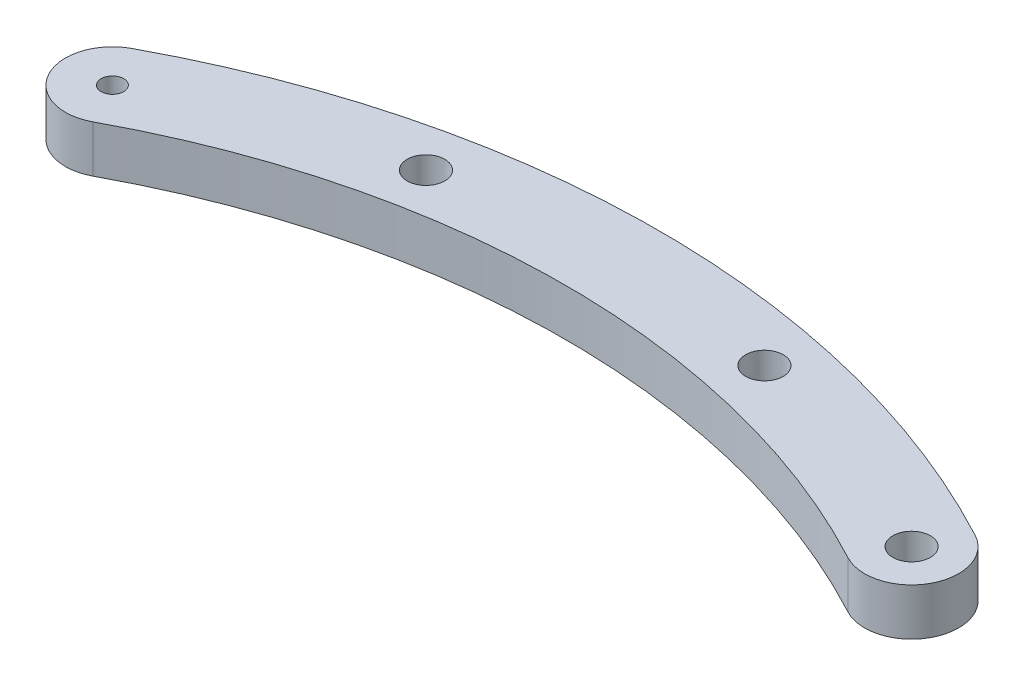
ISO-10303-21;
HEADER;
FILE_DESCRIPTION(('STEP AP214'),'2;1');
FILE_NAME('part.step','',(''),(''),'','','');
FILE_SCHEMA(('AUTOMOTIVE_DESIGN { 1 0 10303 214 1 1 1 1 }'));
ENDSEC;
DATA;
#1=APPLICATION_CONTEXT('core data for automotive mechanical design processes');
#2=APPLICATION_PROTOCOL_DEFINITION('international standard','automotive_design',2000,#1);
#3=PRODUCT_CONTEXT('',#1,'mechanical');
#4=PRODUCT('Part','Part','',(#3));
#5=PRODUCT_RELATED_PRODUCT_CATEGORY('part','',(#4));
#6=PRODUCT_DEFINITION_FORMATION('','',#4);
#7=PRODUCT_DEFINITION_CONTEXT('part definition',#1,'design');
#8=PRODUCT_DEFINITION('design','',#6,#7);
#9=PRODUCT_DEFINITION_SHAPE('','',#8);
#10=(LENGTH_UNIT() NAMED_UNIT(*) SI_UNIT(.MILLI.,.METRE.));
#11=(NAMED_UNIT(*) PLANE_ANGLE_UNIT() SI_UNIT($,.RADIAN.));
#12=(NAMED_UNIT(*) SI_UNIT($,.STERADIAN.) SOLID_ANGLE_UNIT());
#13=UNCERTAINTY_MEASURE_WITH_UNIT(LENGTH_MEASURE(1.E-05),#10,'distance_accuracy_value','');
#14=(GEOMETRIC_REPRESENTATION_CONTEXT(3) GLOBAL_UNCERTAINTY_ASSIGNED_CONTEXT((#13)) GLOBAL_UNIT_ASSIGNED_CONTEXT((#10,
#11,#12)) REPRESENTATION_CONTEXT('',''));
#15=CARTESIAN_POINT('',(0.,0.,0.));
#16=DIRECTION('',(0.,0.,1.));
#17=DIRECTION('',(1.,0.,0.));
#18=AXIS2_PLACEMENT_3D('',#15,#16,#17);
#19=CARTESIAN_POINT('',(0.,2.5,0.));
#20=DIRECTION('',(0.,-1.,0.));
#21=DIRECTION('',(0.,0.,-1.));
#22=AXIS2_PLACEMENT_3D('',#19,#20,#21);
#23=CYLINDRICAL_SURFACE('',#22,2.50000000000001);
#24=CARTESIAN_POINT('',(0.,0.,0.));
#25=DIRECTION('',(0.,1.,0.));
#26=DIRECTION('',(0.,0.,1.));
#27=AXIS2_PLACEMENT_3D('',#24,#25,#26);
#28=CIRCLE('',#27,2.50000000000001);
#29=CARTESIAN_POINT('',(-1.18055555555556,0.,-2.20369884064201));
#30=VERTEX_POINT('',#29);
#31=CARTESIAN_POINT('',(1.18055555555556,0.,2.20369884064201));
#32=VERTEX_POINT('',#31);
#33=EDGE_CURVE('E112',#30,#32,#28,.T.);
#34=ORIENTED_EDGE('',*,*,#33,.T.);
#35=DIRECTION('',(0.,-1.,0.));
#36=VECTOR('',#35,1.);
#37=CARTESIAN_POINT('',(1.18055555555556,2.5,2.20369884064201));
#38=LINE('',#37,#36);
#39=CARTESIAN_POINT('',(1.18055555555556,2.5,2.20369884064201));
#40=VERTEX_POINT('',#39);
#41=EDGE_CURVE('E11',#40,#32,#38,.T.);
#42=ORIENTED_EDGE('',*,*,#41,.F.);
#43=CARTESIAN_POINT('',(0.,2.5,0.));
#44=DIRECTION('',(0.,1.,0.));
#45=DIRECTION('',(0.,0.,1.));
#46=AXIS2_PLACEMENT_3D('',#43,#44,#45);
#47=CIRCLE('',#46,2.50000000000001);
#48=CARTESIAN_POINT('',(-1.18055555555556,2.5,-2.20369884064201));
#49=VERTEX_POINT('',#48);
#50=EDGE_CURVE('E92',#49,#40,#47,.T.);
#51=ORIENTED_EDGE('',*,*,#50,.F.);
#52=DIRECTION('',(0.,-1.,0.));
#53=VECTOR('',#52,1.);
#54=CARTESIAN_POINT('',(-1.18055555555556,2.5,-2.20369884064201));
#55=LINE('',#54,#53);
#56=EDGE_CURVE('E58',#49,#30,#55,.T.);
#57=ORIENTED_EDGE('',*,*,#56,.T.);
#58=EDGE_LOOP('',(#34,#42,#51,#57));
#59=FACE_BOUND('',#58,.T.);
#60=ADVANCED_FACE('F41',(#59),#23,.T.);
#61=CARTESIAN_POINT('',(21.25,2.5,39.6665791315561));
#62=DIRECTION('',(0.,-1.,0.));
#63=DIRECTION('',(0.,0.,-1.));
#64=AXIS2_PLACEMENT_3D('',#61,#62,#63);
#65=CYLINDRICAL_SURFACE('',#64,42.5);
#66=CARTESIAN_POINT('',(21.25,0.,39.6665791315561));
#67=DIRECTION('',(0.,1.,0.));
#68=DIRECTION('',(0.,0.,1.));
#69=AXIS2_PLACEMENT_3D('',#66,#67,#68);
#70=CIRCLE('',#69,42.5);
#71=CARTESIAN_POINT('',(41.3194444444444,0.,2.20369884064201));
#72=VERTEX_POINT('',#71);
#73=EDGE_CURVE('E97',#32,#72,#70,.F.);
#74=ORIENTED_EDGE('',*,*,#73,.T.);
#75=DIRECTION('',(0.,-1.,0.));
#76=VECTOR('',#75,1.);
#77=CARTESIAN_POINT('',(41.3194444444444,2.5,2.20369884064201));
#78=LINE('',#77,#76);
#79=CARTESIAN_POINT('',(41.3194444444444,2.5,2.20369884064201));
#80=VERTEX_POINT('',#79);
#81=EDGE_CURVE('E50',#80,#72,#78,.T.);
#82=ORIENTED_EDGE('',*,*,#81,.F.);
#83=CARTESIAN_POINT('',(21.25,2.5,39.6665791315561));
#84=DIRECTION('',(0.,1.,0.));
#85=DIRECTION('',(0.,0.,1.));
#86=AXIS2_PLACEMENT_3D('',#83,#84,#85);
#87=CIRCLE('',#86,42.5);
#88=EDGE_CURVE('E84',#40,#80,#87,.F.);
#89=ORIENTED_EDGE('',*,*,#88,.F.);
#90=ORIENTED_EDGE('',*,*,#41,.T.);
#91=EDGE_LOOP('',(#74,#82,#89,#90));
#92=FACE_BOUND('',#91,.T.);
#93=ADVANCED_FACE('F96',(#92),#65,.F.);
#94=CARTESIAN_POINT('',(42.5,2.5,0.));
#95=DIRECTION('',(0.,-1.,0.));
#96=DIRECTION('',(0.,0.,-1.));
#97=AXIS2_PLACEMENT_3D('',#94,#95,#96);
#98=CYLINDRICAL_SURFACE('',#97,2.50000000000001);
#99=CARTESIAN_POINT('',(42.5,0.,0.));
#100=DIRECTION('',(0.,1.,0.));
#101=DIRECTION('',(0.,0.,1.));
#102=AXIS2_PLACEMENT_3D('',#99,#100,#101);
#103=CIRCLE('',#102,2.50000000000001);
#104=CARTESIAN_POINT('',(43.6805555555556,0.,-2.20369884064201));
#105=VERTEX_POINT('',#104);
#106=EDGE_CURVE('E116',#72,#105,#103,.T.);
#107=ORIENTED_EDGE('',*,*,#106,.T.);
#108=DIRECTION('',(0.,-1.,0.));
#109=VECTOR('',#108,1.);
#110=CARTESIAN_POINT('',(43.6805555555556,2.5,-2.20369884064201));
#111=LINE('',#110,#109);
#112=CARTESIAN_POINT('',(43.6805555555556,2.5,-2.20369884064201));
#113=VERTEX_POINT('',#112);
#114=EDGE_CURVE('E73',#113,#105,#111,.T.);
#115=ORIENTED_EDGE('',*,*,#114,.F.);
#116=CARTESIAN_POINT('',(42.5,2.5,0.));
#117=DIRECTION('',(0.,1.,0.));
#118=DIRECTION('',(0.,0.,1.));
#119=AXIS2_PLACEMENT_3D('',#116,#117,#118);
#120=CIRCLE('',#119,2.50000000000001);
#121=EDGE_CURVE('E91',#80,#113,#120,.T.);
#122=ORIENTED_EDGE('',*,*,#121,.F.);
#123=ORIENTED_EDGE('',*,*,#81,.T.);
#124=EDGE_LOOP('',(#107,#115,#122,#123));
#125=FACE_BOUND('',#124,.T.);
#126=ADVANCED_FACE('F100',(#125),#98,.T.);
#127=CARTESIAN_POINT('',(21.25,2.5,39.6665791315561));
#128=DIRECTION('',(0.,-1.,0.));
#129=DIRECTION('',(0.,0.,-1.));
#130=AXIS2_PLACEMENT_3D('',#127,#128,#129);
#131=CYLINDRICAL_SURFACE('',#130,47.5);
#132=CARTESIAN_POINT('',(21.25,0.,39.6665791315561));
#133=DIRECTION('',(0.,1.,0.));
#134=DIRECTION('',(0.,0.,1.));
#135=AXIS2_PLACEMENT_3D('',#132,#133,#134);
#136=CIRCLE('',#135,47.5);
#137=EDGE_CURVE('E118',#30,#105,#136,.F.);
#138=ORIENTED_EDGE('',*,*,#137,.F.);
#139=ORIENTED_EDGE('',*,*,#56,.F.);
#140=CARTESIAN_POINT('',(21.25,2.5,39.6665791315561));
#141=DIRECTION('',(0.,1.,0.));
#142=DIRECTION('',(0.,0.,1.));
#143=AXIS2_PLACEMENT_3D('',#140,#141,#142);
#144=CIRCLE('',#143,47.5);
#145=EDGE_CURVE('E101',#49,#113,#144,.F.);
#146=ORIENTED_EDGE('',*,*,#145,.T.);
#147=ORIENTED_EDGE('',*,*,#114,.T.);
#148=EDGE_LOOP('',(#138,#139,#146,#147));
#149=FACE_BOUND('',#148,.T.);
#150=ADVANCED_FACE('F178',(#149),#131,.T.);
#151=CARTESIAN_POINT('',(0.,2.5,0.));
#152=DIRECTION('',(0.,-1.,0.));
#153=DIRECTION('',(0.,0.,-1.));
#154=AXIS2_PLACEMENT_3D('',#151,#152,#153);
#155=CYLINDRICAL_SURFACE('',#154,0.6);
#156=CARTESIAN_POINT('',(0.,2.5,0.));
#157=DIRECTION('',(0.,1.,0.));
#158=DIRECTION('',(0.,0.,1.));
#159=AXIS2_PLACEMENT_3D('',#156,#157,#158);
#160=CIRCLE('',#159,0.6);
#161=CARTESIAN_POINT('',(0.,2.5,0.6));
#162=VERTEX_POINT('',#161);
#163=EDGE_CURVE('E124',#162,#162,#160,.T.);
#164=ORIENTED_EDGE('',*,*,#163,.T.);
#165=EDGE_LOOP('',(#164));
#166=FACE_BOUND('',#165,.T.);
#167=CARTESIAN_POINT('',(0.,0.,0.));
#168=DIRECTION('',(0.,1.,0.));
#169=DIRECTION('',(0.,0.,1.));
#170=AXIS2_PLACEMENT_3D('',#167,#168,#169);
#171=CIRCLE('',#170,0.6);
#172=CARTESIAN_POINT('',(0.,0.,0.6));
#173=VERTEX_POINT('',#172);
#174=EDGE_CURVE('E109',#173,#173,#171,.T.);
#175=ORIENTED_EDGE('',*,*,#174,.F.);
#176=EDGE_LOOP('',(#175));
#177=FACE_BOUND('',#176,.T.);
#178=ADVANCED_FACE('F43',(#166,#177),#155,.F.);
#179=CARTESIAN_POINT('',(42.5,2.5,0.));
#180=DIRECTION('',(0.,-1.,0.));
#181=DIRECTION('',(0.,0.,-1.));
#182=AXIS2_PLACEMENT_3D('',#179,#180,#181);
#183=CYLINDRICAL_SURFACE('',#182,0.999999999999998);
#184=CARTESIAN_POINT('',(42.5,2.5,0.));
#185=DIRECTION('',(0.,1.,0.));
#186=DIRECTION('',(0.,0.,1.));
#187=AXIS2_PLACEMENT_3D('',#184,#185,#186);
#188=CIRCLE('',#187,0.999999999999998);
#189=CARTESIAN_POINT('',(42.5,2.5,0.999999999999998));
#190=VERTEX_POINT('',#189);
#191=EDGE_CURVE('E103',#190,#190,#188,.T.);
#192=ORIENTED_EDGE('',*,*,#191,.T.);
#193=EDGE_LOOP('',(#192));
#194=FACE_BOUND('',#193,.T.);
#195=CARTESIAN_POINT('',(42.5,0.,0.));
#196=DIRECTION('',(0.,1.,0.));
#197=DIRECTION('',(0.,0.,1.));
#198=AXIS2_PLACEMENT_3D('',#195,#196,#197);
#199=CIRCLE('',#198,0.999999999999998);
#200=CARTESIAN_POINT('',(42.5,0.,0.999999999999998));
#201=VERTEX_POINT('',#200);
#202=EDGE_CURVE('E121',#201,#201,#199,.T.);
#203=ORIENTED_EDGE('',*,*,#202,.F.);
#204=EDGE_LOOP('',(#203));
#205=FACE_BOUND('',#204,.T.);
#206=ADVANCED_FACE('F157',(#194,#205),#183,.F.);
#207=CARTESIAN_POINT('',(0.,2.5,0.));
#208=DIRECTION('',(0.,1.,0.));
#209=DIRECTION('',(0.,0.,1.));
#210=AXIS2_PLACEMENT_3D('',#207,#208,#209);
#211=PLANE('',#210);
#212=CARTESIAN_POINT('',(12.25,2.5,-4.42423623854113));
#213=DIRECTION('',(0.,1.,0.));
#214=DIRECTION('',(0.,0.,1.));
#215=AXIS2_PLACEMENT_3D('',#212,#213,#214);
#216=CIRCLE('',#215,1.);
#217=CARTESIAN_POINT('',(12.25,2.5,-3.42423623854112));
#218=VERTEX_POINT('',#217);
#219=EDGE_CURVE('E139',#218,#218,#216,.T.);
#220=ORIENTED_EDGE('',*,*,#219,.F.);
#221=EDGE_LOOP('',(#220));
#222=FACE_BOUND('',#221,.T.);
#223=CARTESIAN_POINT('',(30.25,2.5,-4.42423623854113));
#224=DIRECTION('',(0.,1.,0.));
#225=DIRECTION('',(0.,0.,1.));
#226=AXIS2_PLACEMENT_3D('',#223,#224,#225);
#227=CIRCLE('',#226,0.999999999999998);
#228=CARTESIAN_POINT('',(30.25,2.5,-3.42423623854113));
#229=VERTEX_POINT('',#228);
#230=EDGE_CURVE('E136',#229,#229,#227,.T.);
#231=ORIENTED_EDGE('',*,*,#230,.F.);
#232=EDGE_LOOP('',(#231));
#233=FACE_BOUND('',#232,.T.);
#234=ORIENTED_EDGE('',*,*,#163,.F.);
#235=EDGE_LOOP('',(#234));
#236=FACE_BOUND('',#235,.T.);
#237=ORIENTED_EDGE('',*,*,#50,.T.);
#238=ORIENTED_EDGE('',*,*,#88,.T.);
#239=ORIENTED_EDGE('',*,*,#121,.T.);
#240=ORIENTED_EDGE('',*,*,#145,.F.);
#241=EDGE_LOOP('',(#237,#238,#239,#240));
#242=FACE_BOUND('',#241,.T.);
#243=ORIENTED_EDGE('',*,*,#191,.F.);
#244=EDGE_LOOP('',(#243));
#245=FACE_BOUND('',#244,.T.);
#246=ADVANCED_FACE('F87',(#222,#233,#236,#242,#245),#211,.T.);
#247=CARTESIAN_POINT('',(0.,0.,0.));
#248=DIRECTION('',(0.,1.,0.));
#249=DIRECTION('',(0.,0.,1.));
#250=AXIS2_PLACEMENT_3D('',#247,#248,#249);
#251=PLANE('',#250);
#252=CARTESIAN_POINT('',(12.25,0.,-4.42423623854113));
#253=DIRECTION('',(0.,1.,0.));
#254=DIRECTION('',(0.,0.,1.));
#255=AXIS2_PLACEMENT_3D('',#252,#253,#254);
#256=CIRCLE('',#255,1.);
#257=CARTESIAN_POINT('',(12.25,0.,-3.42423623854112));
#258=VERTEX_POINT('',#257);
#259=EDGE_CURVE('E113',#258,#258,#256,.T.);
#260=ORIENTED_EDGE('',*,*,#259,.T.);
#261=EDGE_LOOP('',(#260));
#262=FACE_BOUND('',#261,.T.);
#263=CARTESIAN_POINT('',(30.25,0.,-4.42423623854113));
#264=DIRECTION('',(0.,1.,0.));
#265=DIRECTION('',(0.,0.,1.));
#266=AXIS2_PLACEMENT_3D('',#263,#264,#265);
#267=CIRCLE('',#266,0.999999999999998);
#268=CARTESIAN_POINT('',(30.25,0.,-3.42423623854113));
#269=VERTEX_POINT('',#268);
#270=EDGE_CURVE('E133',#269,#269,#267,.T.);
#271=ORIENTED_EDGE('',*,*,#270,.T.);
#272=EDGE_LOOP('',(#271));
#273=FACE_BOUND('',#272,.T.);
#274=ORIENTED_EDGE('',*,*,#174,.T.);
#275=EDGE_LOOP('',(#274));
#276=FACE_BOUND('',#275,.T.);
#277=ORIENTED_EDGE('',*,*,#33,.F.);
#278=ORIENTED_EDGE('',*,*,#137,.T.);
#279=ORIENTED_EDGE('',*,*,#106,.F.);
#280=ORIENTED_EDGE('',*,*,#73,.F.);
#281=EDGE_LOOP('',(#277,#278,#279,#280));
#282=FACE_BOUND('',#281,.T.);
#283=ORIENTED_EDGE('',*,*,#202,.T.);
#284=EDGE_LOOP('',(#283));
#285=FACE_BOUND('',#284,.T.);
#286=ADVANCED_FACE('F145',(#262,#273,#276,#282,#285),#251,.F.);
#287=CARTESIAN_POINT('',(30.25,0.,-4.42423623854113));
#288=DIRECTION('',(0.,1.,0.));
#289=DIRECTION('',(0.,0.,1.));
#290=AXIS2_PLACEMENT_3D('',#287,#288,#289);
#291=CYLINDRICAL_SURFACE('',#290,0.999999999999998);
#292=ORIENTED_EDGE('',*,*,#270,.F.);
#293=EDGE_LOOP('',(#292));
#294=FACE_BOUND('',#293,.T.);
#295=ORIENTED_EDGE('',*,*,#230,.T.);
#296=EDGE_LOOP('',(#295));
#297=FACE_BOUND('',#296,.T.);
#298=ADVANCED_FACE('F151',(#294,#297),#291,.F.);
#299=CARTESIAN_POINT('',(12.25,0.,-4.42423623854113));
#300=DIRECTION('',(0.,1.,0.));
#301=DIRECTION('',(0.,0.,1.));
#302=AXIS2_PLACEMENT_3D('',#299,#300,#301);
#303=CYLINDRICAL_SURFACE('',#302,1.);
#304=ORIENTED_EDGE('',*,*,#259,.F.);
#305=EDGE_LOOP('',(#304));
#306=FACE_BOUND('',#305,.T.);
#307=ORIENTED_EDGE('',*,*,#219,.T.);
#308=EDGE_LOOP('',(#307));
#309=FACE_BOUND('',#308,.T.);
#310=ADVANCED_FACE('F148',(#306,#309),#303,.F.);
#311=CLOSED_SHELL('',(#60,#93,#126,#150,#178,#206,#246,#286,#298,#310));
#312=MANIFOLD_SOLID_BREP('B2',#311);
#313=ADVANCED_BREP_SHAPE_REPRESENTATION('',(#18,#312),#14);
#314=SHAPE_DEFINITION_REPRESENTATION(#9,#313);
ENDSEC;
END-ISO-10303-21;
